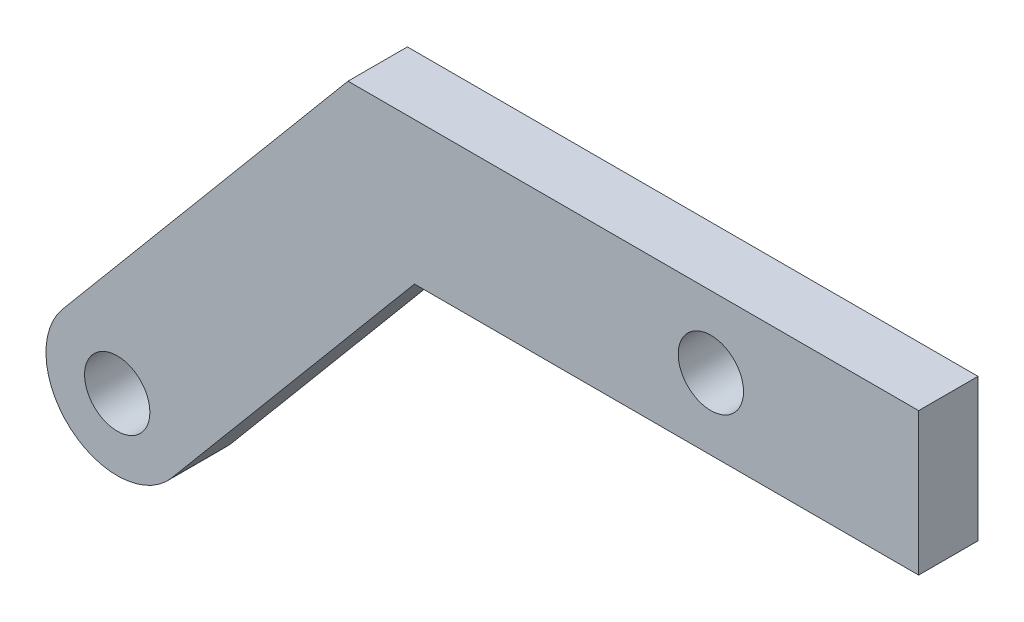
ISO-10303-21;
HEADER;
FILE_DESCRIPTION(('STEP AP214'),'2;1');
FILE_NAME('part.step','',(''),(''),'','','');
FILE_SCHEMA(('AUTOMOTIVE_DESIGN { 1 0 10303 214 1 1 1 1 }'));
ENDSEC;
DATA;
#1=APPLICATION_CONTEXT('core data for automotive mechanical design processes');
#2=APPLICATION_PROTOCOL_DEFINITION('international standard','automotive_design',2000,#1);
#3=PRODUCT_CONTEXT('',#1,'mechanical');
#4=PRODUCT('Part','Part','',(#3));
#5=PRODUCT_RELATED_PRODUCT_CATEGORY('part','',(#4));
#6=PRODUCT_DEFINITION_FORMATION('','',#4);
#7=PRODUCT_DEFINITION_CONTEXT('part definition',#1,'design');
#8=PRODUCT_DEFINITION('design','',#6,#7);
#9=PRODUCT_DEFINITION_SHAPE('','',#8);
#10=(LENGTH_UNIT() NAMED_UNIT(*) SI_UNIT(.MILLI.,.METRE.));
#11=(NAMED_UNIT(*) PLANE_ANGLE_UNIT() SI_UNIT($,.RADIAN.));
#12=(NAMED_UNIT(*) SI_UNIT($,.STERADIAN.) SOLID_ANGLE_UNIT());
#13=UNCERTAINTY_MEASURE_WITH_UNIT(LENGTH_MEASURE(1.E-05),#10,'distance_accuracy_value','');
#14=(GEOMETRIC_REPRESENTATION_CONTEXT(3) GLOBAL_UNCERTAINTY_ASSIGNED_CONTEXT((#13)) GLOBAL_UNIT_ASSIGNED_CONTEXT((#10,
#11,#12)) REPRESENTATION_CONTEXT('',''));
#15=CARTESIAN_POINT('',(0.,0.,0.));
#16=DIRECTION('',(0.,0.,1.));
#17=DIRECTION('',(1.,0.,0.));
#18=AXIS2_PLACEMENT_3D('',#15,#16,#17);
#19=CARTESIAN_POINT('',(0.,0.,10.));
#20=DIRECTION('',(0.,0.,1.));
#21=DIRECTION('',(1.,0.,0.));
#22=AXIS2_PLACEMENT_3D('',#19,#20,#21);
#23=PLANE('',#22);
#24=CARTESIAN_POINT('',(100.,53.,10.));
#25=DIRECTION('',(0.,0.,1.));
#26=DIRECTION('',(1.,0.,0.));
#27=AXIS2_PLACEMENT_3D('',#24,#25,#26);
#28=CIRCLE('',#27,5.5);
#29=CARTESIAN_POINT('',(105.5,53.,10.));
#30=VERTEX_POINT('',#29);
#31=EDGE_CURVE('E132',#30,#30,#28,.T.);
#32=ORIENTED_EDGE('',*,*,#31,.F.);
#33=EDGE_LOOP('',(#32));
#34=FACE_BOUND('',#33,.T.);
#35=CARTESIAN_POINT('',(0.,0.,10.));
#36=DIRECTION('',(0.,0.,1.));
#37=DIRECTION('',(1.,0.,0.));
#38=AXIS2_PLACEMENT_3D('',#35,#36,#37);
#39=CIRCLE('',#38,12.);
#40=CARTESIAN_POINT('',(-9.1925333174277,7.71345131623852,10.));
#41=VERTEX_POINT('',#40);
#42=CARTESIAN_POINT('',(9.19253331742769,-7.71345131623852,10.));
#43=VERTEX_POINT('',#42);
#44=EDGE_CURVE('E139',#41,#43,#39,.T.);
#45=ORIENTED_EDGE('',*,*,#44,.T.);
#46=DIRECTION('',(0.642787609686544,0.766044443118974,0.));
#47=VECTOR('',#46,1.);
#48=CARTESIAN_POINT('',(9.19253331742769,-7.71345131623852,10.));
#49=LINE('',#48,#47);
#50=CARTESIAN_POINT('',(50.0679723502563,41.,10.));
#51=VERTEX_POINT('',#50);
#52=EDGE_CURVE('E97',#43,#51,#49,.T.);
#53=ORIENTED_EDGE('',*,*,#52,.T.);
#54=DIRECTION('',(1.,0.,0.));
#55=VECTOR('',#54,1.);
#56=CARTESIAN_POINT('',(50.0679723502563,41.,10.));
#57=LINE('',#56,#55);
#58=CARTESIAN_POINT('',(135.,41.,10.));
#59=VERTEX_POINT('',#58);
#60=EDGE_CURVE('E110',#51,#59,#57,.T.);
#61=ORIENTED_EDGE('',*,*,#60,.T.);
#62=DIRECTION('',(0.,1.,0.));
#63=VECTOR('',#62,1.);
#64=CARTESIAN_POINT('',(135.,41.,10.));
#65=LINE('',#64,#63);
#66=CARTESIAN_POINT('',(135.,65.,10.));
#67=VERTEX_POINT('',#66);
#68=EDGE_CURVE('E104',#59,#67,#65,.T.);
#69=ORIENTED_EDGE('',*,*,#68,.T.);
#70=DIRECTION('',(-1.,0.,0.));
#71=VECTOR('',#70,1.);
#72=CARTESIAN_POINT('',(135.,65.,10.));
#73=LINE('',#72,#71);
#74=CARTESIAN_POINT('',(38.8765885545364,65.,10.));
#75=VERTEX_POINT('',#74);
#76=EDGE_CURVE('E108',#67,#75,#73,.T.);
#77=ORIENTED_EDGE('',*,*,#76,.T.);
#78=DIRECTION('',(-0.642787609686543,-0.766044443118975,0.));
#79=VECTOR('',#78,1.);
#80=CARTESIAN_POINT('',(38.8765885545364,65.,10.));
#81=LINE('',#80,#79);
#82=EDGE_CURVE('E60',#75,#41,#81,.T.);
#83=ORIENTED_EDGE('',*,*,#82,.T.);
#84=EDGE_LOOP('',(#45,#53,#61,#69,#77,#83));
#85=FACE_BOUND('',#84,.T.);
#86=CARTESIAN_POINT('',(0.,0.,10.));
#87=DIRECTION('',(0.,0.,1.));
#88=DIRECTION('',(1.,0.,0.));
#89=AXIS2_PLACEMENT_3D('',#86,#87,#88);
#90=CIRCLE('',#89,5.5);
#91=CARTESIAN_POINT('',(5.5,0.,10.));
#92=VERTEX_POINT('',#91);
#93=EDGE_CURVE('E181',#92,#92,#90,.T.);
#94=ORIENTED_EDGE('',*,*,#93,.F.);
#95=EDGE_LOOP('',(#94));
#96=FACE_BOUND('',#95,.T.);
#97=ADVANCED_FACE('F43',(#34,#85,#96),#23,.T.);
#98=CARTESIAN_POINT('',(0.,0.,0.));
#99=DIRECTION('',(0.,0.,1.));
#100=DIRECTION('',(1.,0.,0.));
#101=AXIS2_PLACEMENT_3D('',#98,#99,#100);
#102=PLANE('',#101);
#103=CARTESIAN_POINT('',(0.,0.,0.));
#104=DIRECTION('',(0.,0.,1.));
#105=DIRECTION('',(1.,0.,0.));
#106=AXIS2_PLACEMENT_3D('',#103,#104,#105);
#107=CIRCLE('',#106,12.);
#108=CARTESIAN_POINT('',(-9.1925333174277,7.71345131623852,0.));
#109=VERTEX_POINT('',#108);
#110=CARTESIAN_POINT('',(9.19253331742769,-7.71345131623852,0.));
#111=VERTEX_POINT('',#110);
#112=EDGE_CURVE('E128',#109,#111,#107,.T.);
#113=ORIENTED_EDGE('',*,*,#112,.F.);
#114=DIRECTION('',(-0.642787609686543,-0.766044443118975,0.));
#115=VECTOR('',#114,1.);
#116=CARTESIAN_POINT('',(38.8765885545364,65.,0.));
#117=LINE('',#116,#115);
#118=CARTESIAN_POINT('',(38.8765885545364,65.,0.));
#119=VERTEX_POINT('',#118);
#120=EDGE_CURVE('E89',#119,#109,#117,.T.);
#121=ORIENTED_EDGE('',*,*,#120,.F.);
#122=DIRECTION('',(-1.,0.,0.));
#123=VECTOR('',#122,1.);
#124=CARTESIAN_POINT('',(135.,65.,0.));
#125=LINE('',#124,#123);
#126=CARTESIAN_POINT('',(135.,65.,0.));
#127=VERTEX_POINT('',#126);
#128=EDGE_CURVE('E83',#127,#119,#125,.T.);
#129=ORIENTED_EDGE('',*,*,#128,.F.);
#130=DIRECTION('',(0.,1.,0.));
#131=VECTOR('',#130,1.);
#132=CARTESIAN_POINT('',(135.,41.,0.));
#133=LINE('',#132,#131);
#134=CARTESIAN_POINT('',(135.,41.,0.));
#135=VERTEX_POINT('',#134);
#136=EDGE_CURVE('E118',#135,#127,#133,.T.);
#137=ORIENTED_EDGE('',*,*,#136,.F.);
#138=DIRECTION('',(1.,0.,0.));
#139=VECTOR('',#138,1.);
#140=CARTESIAN_POINT('',(50.0679723502563,41.,0.));
#141=LINE('',#140,#139);
#142=CARTESIAN_POINT('',(50.0679723502563,41.,0.));
#143=VERTEX_POINT('',#142);
#144=EDGE_CURVE('E134',#143,#135,#141,.T.);
#145=ORIENTED_EDGE('',*,*,#144,.F.);
#146=DIRECTION('',(0.642787609686544,0.766044443118974,0.));
#147=VECTOR('',#146,1.);
#148=CARTESIAN_POINT('',(9.19253331742769,-7.71345131623852,0.));
#149=LINE('',#148,#147);
#150=EDGE_CURVE('E131',#111,#143,#149,.T.);
#151=ORIENTED_EDGE('',*,*,#150,.F.);
#152=EDGE_LOOP('',(#113,#121,#129,#137,#145,#151));
#153=FACE_BOUND('',#152,.T.);
#154=CARTESIAN_POINT('',(100.,53.,0.));
#155=DIRECTION('',(0.,0.,1.));
#156=DIRECTION('',(1.,0.,0.));
#157=AXIS2_PLACEMENT_3D('',#154,#155,#156);
#158=CIRCLE('',#157,5.5);
#159=CARTESIAN_POINT('',(105.5,53.,0.));
#160=VERTEX_POINT('',#159);
#161=EDGE_CURVE('E187',#160,#160,#158,.T.);
#162=ORIENTED_EDGE('',*,*,#161,.T.);
#163=EDGE_LOOP('',(#162));
#164=FACE_BOUND('',#163,.T.);
#165=CARTESIAN_POINT('',(0.,0.,0.));
#166=DIRECTION('',(0.,0.,1.));
#167=DIRECTION('',(1.,0.,0.));
#168=AXIS2_PLACEMENT_3D('',#165,#166,#167);
#169=CIRCLE('',#168,5.5);
#170=CARTESIAN_POINT('',(5.5,0.,0.));
#171=VERTEX_POINT('',#170);
#172=EDGE_CURVE('E184',#171,#171,#169,.T.);
#173=ORIENTED_EDGE('',*,*,#172,.T.);
#174=EDGE_LOOP('',(#173));
#175=FACE_BOUND('',#174,.T.);
#176=ADVANCED_FACE('F148',(#153,#164,#175),#102,.F.);
#177=CARTESIAN_POINT('',(0.,0.,10.));
#178=DIRECTION('',(0.,0.,-1.));
#179=DIRECTION('',(-1.,0.,0.));
#180=AXIS2_PLACEMENT_3D('',#177,#178,#179);
#181=CYLINDRICAL_SURFACE('',#180,12.);
#182=ORIENTED_EDGE('',*,*,#112,.T.);
#183=DIRECTION('',(0.,0.,-1.));
#184=VECTOR('',#183,1.);
#185=CARTESIAN_POINT('',(9.19253331742769,-7.71345131623852,10.));
#186=LINE('',#185,#184);
#187=EDGE_CURVE('E11',#43,#111,#186,.T.);
#188=ORIENTED_EDGE('',*,*,#187,.F.);
#189=ORIENTED_EDGE('',*,*,#44,.F.);
#190=DIRECTION('',(0.,0.,-1.));
#191=VECTOR('',#190,1.);
#192=CARTESIAN_POINT('',(-9.1925333174277,7.71345131623852,10.));
#193=LINE('',#192,#191);
#194=EDGE_CURVE('E124',#41,#109,#193,.T.);
#195=ORIENTED_EDGE('',*,*,#194,.T.);
#196=EDGE_LOOP('',(#182,#188,#189,#195));
#197=FACE_BOUND('',#196,.T.);
#198=ADVANCED_FACE('F45',(#197),#181,.T.);
#199=CARTESIAN_POINT('',(9.19253331742769,-7.71345131623852,10.));
#200=DIRECTION('',(-0.766044443118974,0.642787609686544,0.));
#201=DIRECTION('',(-0.642787609686544,-0.766044443118974,0.));
#202=AXIS2_PLACEMENT_3D('',#199,#200,#201);
#203=PLANE('',#202);
#204=ORIENTED_EDGE('',*,*,#150,.T.);
#205=DIRECTION('',(0.,0.,-1.));
#206=VECTOR('',#205,1.);
#207=CARTESIAN_POINT('',(50.0679723502563,41.,10.));
#208=LINE('',#207,#206);
#209=EDGE_CURVE('E52',#51,#143,#208,.T.);
#210=ORIENTED_EDGE('',*,*,#209,.F.);
#211=ORIENTED_EDGE('',*,*,#52,.F.);
#212=ORIENTED_EDGE('',*,*,#187,.T.);
#213=EDGE_LOOP('',(#204,#210,#211,#212));
#214=FACE_BOUND('',#213,.T.);
#215=ADVANCED_FACE('F230',(#214),#203,.F.);
#216=CARTESIAN_POINT('',(50.0679723502563,41.,10.));
#217=DIRECTION('',(0.,1.,0.));
#218=DIRECTION('',(0.,0.,1.));
#219=AXIS2_PLACEMENT_3D('',#216,#217,#218);
#220=PLANE('',#219);
#221=ORIENTED_EDGE('',*,*,#144,.T.);
#222=DIRECTION('',(0.,0.,-1.));
#223=VECTOR('',#222,1.);
#224=CARTESIAN_POINT('',(135.,41.,10.));
#225=LINE('',#224,#223);
#226=EDGE_CURVE('E119',#59,#135,#225,.T.);
#227=ORIENTED_EDGE('',*,*,#226,.F.);
#228=ORIENTED_EDGE('',*,*,#60,.F.);
#229=ORIENTED_EDGE('',*,*,#209,.T.);
#230=EDGE_LOOP('',(#221,#227,#228,#229));
#231=FACE_BOUND('',#230,.T.);
#232=ADVANCED_FACE('F145',(#231),#220,.F.);
#233=CARTESIAN_POINT('',(135.,41.,10.));
#234=DIRECTION('',(-1.,0.,0.));
#235=DIRECTION('',(0.,0.,1.));
#236=AXIS2_PLACEMENT_3D('',#233,#234,#235);
#237=PLANE('',#236);
#238=ORIENTED_EDGE('',*,*,#136,.T.);
#239=DIRECTION('',(0.,0.,-1.));
#240=VECTOR('',#239,1.);
#241=CARTESIAN_POINT('',(135.,65.,10.));
#242=LINE('',#241,#240);
#243=EDGE_CURVE('E115',#67,#127,#242,.T.);
#244=ORIENTED_EDGE('',*,*,#243,.F.);
#245=ORIENTED_EDGE('',*,*,#68,.F.);
#246=ORIENTED_EDGE('',*,*,#226,.T.);
#247=EDGE_LOOP('',(#238,#244,#245,#246));
#248=FACE_BOUND('',#247,.T.);
#249=ADVANCED_FACE('F116',(#248),#237,.F.);
#250=CARTESIAN_POINT('',(135.,65.,10.));
#251=DIRECTION('',(0.,-1.,0.));
#252=DIRECTION('',(1.,0.,0.));
#253=AXIS2_PLACEMENT_3D('',#250,#251,#252);
#254=PLANE('',#253);
#255=ORIENTED_EDGE('',*,*,#128,.T.);
#256=DIRECTION('',(0.,0.,-1.));
#257=VECTOR('',#256,1.);
#258=CARTESIAN_POINT('',(38.8765885545364,65.,10.));
#259=LINE('',#258,#257);
#260=EDGE_CURVE('E120',#75,#119,#259,.T.);
#261=ORIENTED_EDGE('',*,*,#260,.F.);
#262=ORIENTED_EDGE('',*,*,#76,.F.);
#263=ORIENTED_EDGE('',*,*,#243,.T.);
#264=EDGE_LOOP('',(#255,#261,#262,#263));
#265=FACE_BOUND('',#264,.T.);
#266=ADVANCED_FACE('F122',(#265),#254,.F.);
#267=CARTESIAN_POINT('',(38.8765885545364,65.,10.));
#268=DIRECTION('',(0.766044443118975,-0.642787609686543,0.));
#269=DIRECTION('',(0.642787609686543,0.766044443118975,0.));
#270=AXIS2_PLACEMENT_3D('',#267,#268,#269);
#271=PLANE('',#270);
#272=ORIENTED_EDGE('',*,*,#120,.T.);
#273=ORIENTED_EDGE('',*,*,#194,.F.);
#274=ORIENTED_EDGE('',*,*,#82,.F.);
#275=ORIENTED_EDGE('',*,*,#260,.T.);
#276=EDGE_LOOP('',(#272,#273,#274,#275));
#277=FACE_BOUND('',#276,.T.);
#278=ADVANCED_FACE('F153',(#277),#271,.F.);
#279=CARTESIAN_POINT('',(100.,53.,10.));
#280=DIRECTION('',(0.,0.,-1.));
#281=DIRECTION('',(-1.,0.,0.));
#282=AXIS2_PLACEMENT_3D('',#279,#280,#281);
#283=CYLINDRICAL_SURFACE('',#282,5.5);
#284=ORIENTED_EDGE('',*,*,#31,.T.);
#285=EDGE_LOOP('',(#284));
#286=FACE_BOUND('',#285,.T.);
#287=ORIENTED_EDGE('',*,*,#161,.F.);
#288=EDGE_LOOP('',(#287));
#289=FACE_BOUND('',#288,.T.);
#290=ADVANCED_FACE('F155',(#286,#289),#283,.F.);
#291=CARTESIAN_POINT('',(0.,0.,10.));
#292=DIRECTION('',(0.,0.,-1.));
#293=DIRECTION('',(-1.,0.,0.));
#294=AXIS2_PLACEMENT_3D('',#291,#292,#293);
#295=CYLINDRICAL_SURFACE('',#294,5.5);
#296=ORIENTED_EDGE('',*,*,#93,.T.);
#297=EDGE_LOOP('',(#296));
#298=FACE_BOUND('',#297,.T.);
#299=ORIENTED_EDGE('',*,*,#172,.F.);
#300=EDGE_LOOP('',(#299));
#301=FACE_BOUND('',#300,.T.);
#302=ADVANCED_FACE('F161',(#298,#301),#295,.F.);
#303=CLOSED_SHELL('',(#97,#176,#198,#215,#232,#249,#266,#278,#290,#302));
#304=MANIFOLD_SOLID_BREP('B2',#303);
#305=ADVANCED_BREP_SHAPE_REPRESENTATION('',(#18,#304),#14);
#306=SHAPE_DEFINITION_REPRESENTATION(#9,#305);
ENDSEC;
END-ISO-10303-21;
